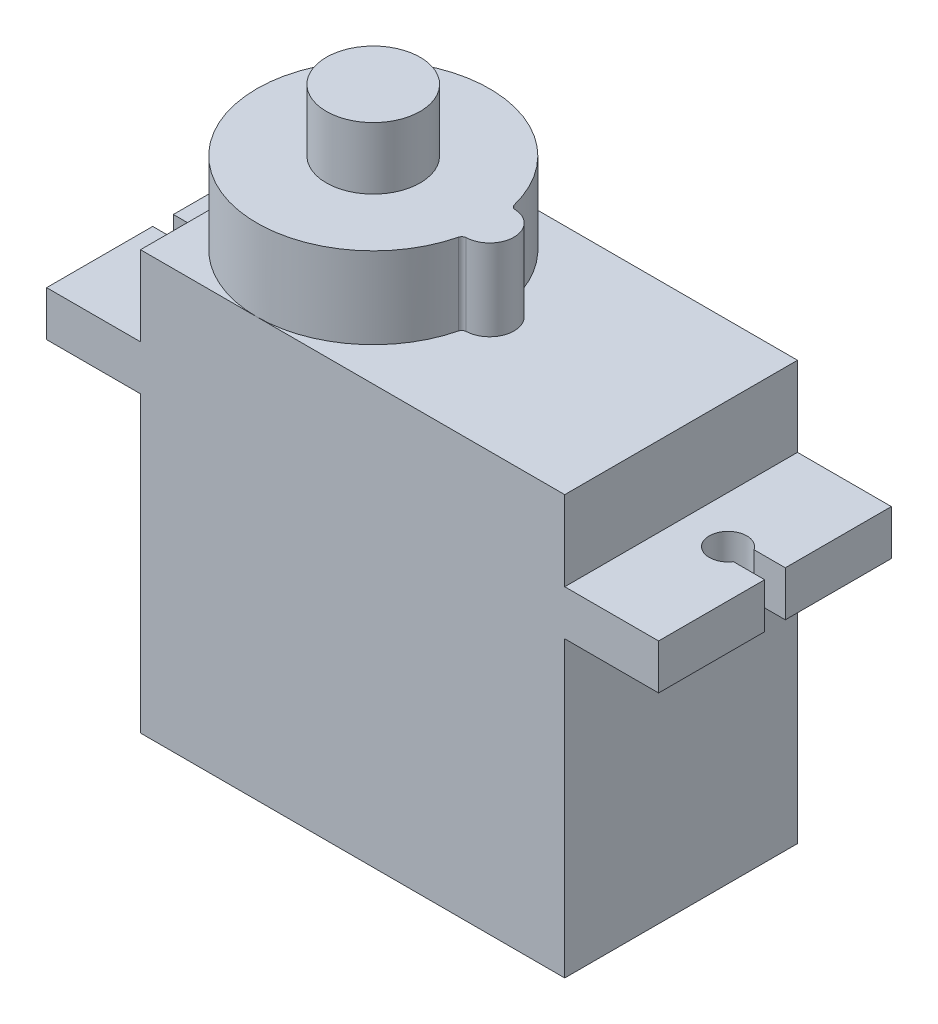
ISO-10303-21;
HEADER;
FILE_DESCRIPTION(('STEP AP214'),'2;1');
FILE_NAME('part.step','',(''),(''),'','','');
FILE_SCHEMA(('AUTOMOTIVE_DESIGN { 1 0 10303 214 1 1 1 1 }'));
ENDSEC;
DATA;
#1=APPLICATION_CONTEXT('core data for automotive mechanical design processes');
#2=APPLICATION_PROTOCOL_DEFINITION('international standard','automotive_design',2000,#1);
#3=PRODUCT_CONTEXT('',#1,'mechanical');
#4=PRODUCT('Part','Part','',(#3));
#5=PRODUCT_RELATED_PRODUCT_CATEGORY('part','',(#4));
#6=PRODUCT_DEFINITION_FORMATION('','',#4);
#7=PRODUCT_DEFINITION_CONTEXT('part definition',#1,'design');
#8=PRODUCT_DEFINITION('design','',#6,#7);
#9=PRODUCT_DEFINITION_SHAPE('','',#8);
#10=(LENGTH_UNIT() NAMED_UNIT(*) SI_UNIT(.MILLI.,.METRE.));
#11=(NAMED_UNIT(*) PLANE_ANGLE_UNIT() SI_UNIT($,.RADIAN.));
#12=(NAMED_UNIT(*) SI_UNIT($,.STERADIAN.) SOLID_ANGLE_UNIT());
#13=UNCERTAINTY_MEASURE_WITH_UNIT(LENGTH_MEASURE(1.E-05),#10,'distance_accuracy_value','');
#14=(GEOMETRIC_REPRESENTATION_CONTEXT(3) GLOBAL_UNCERTAINTY_ASSIGNED_CONTEXT((#13)) GLOBAL_UNIT_ASSIGNED_CONTEXT((#10,
#11,#12)) REPRESENTATION_CONTEXT('',''));
#15=CARTESIAN_POINT('',(0.,0.,0.));
#16=DIRECTION('',(0.,0.,1.));
#17=DIRECTION('',(1.,0.,0.));
#18=AXIS2_PLACEMENT_3D('',#15,#16,#17);
#19=CARTESIAN_POINT('',(-13.6,4.5,-1.2));
#20=DIRECTION('',(1.,0.,0.));
#21=DIRECTION('',(0.,0.,-1.));
#22=AXIS2_PLACEMENT_3D('',#19,#20,#21);
#23=CYLINDRICAL_SURFACE('',#22,0.6);
#24=CARTESIAN_POINT('',(-13.6,4.5,-1.2));
#25=DIRECTION('',(-1.,0.,0.));
#26=DIRECTION('',(0.,0.,1.));
#27=AXIS2_PLACEMENT_3D('',#24,#25,#26);
#28=CIRCLE('',#27,0.6);
#29=CARTESIAN_POINT('',(-13.6,4.5,-0.6));
#30=VERTEX_POINT('',#29);
#31=EDGE_CURVE('E12',#30,#30,#28,.T.);
#32=ORIENTED_EDGE('',*,*,#31,.F.);
#33=EDGE_LOOP('',(#32));
#34=FACE_BOUND('',#33,.T.);
#35=CARTESIAN_POINT('',(-11.3,4.5,-1.2));
#36=DIRECTION('',(-1.,0.,0.));
#37=DIRECTION('',(0.,0.,1.));
#38=AXIS2_PLACEMENT_3D('',#35,#36,#37);
#39=CIRCLE('',#38,0.6);
#40=CARTESIAN_POINT('',(-11.3,4.5,-0.6));
#41=VERTEX_POINT('',#40);
#42=EDGE_CURVE('E65',#41,#41,#39,.T.);
#43=ORIENTED_EDGE('',*,*,#42,.T.);
#44=EDGE_LOOP('',(#43));
#45=FACE_BOUND('',#44,.T.);
#46=ADVANCED_FACE('F62',(#34,#45),#23,.T.);
#47=CARTESIAN_POINT('',(-13.6,0.,0.));
#48=DIRECTION('',(-1.,0.,0.));
#49=DIRECTION('',(0.,0.,1.));
#50=AXIS2_PLACEMENT_3D('',#47,#48,#49);
#51=PLANE('',#50);
#52=ORIENTED_EDGE('',*,*,#31,.T.);
#53=EDGE_LOOP('',(#52));
#54=FACE_BOUND('',#53,.T.);
#55=ADVANCED_FACE('F77',(#54),#51,.T.);
#56=CARTESIAN_POINT('',(-11.3,0.,0.));
#57=DIRECTION('',(-1.,0.,0.));
#58=DIRECTION('',(0.,0.,1.));
#59=AXIS2_PLACEMENT_3D('',#56,#57,#58);
#60=PLANE('',#59);
#61=ORIENTED_EDGE('',*,*,#42,.F.);
#62=EDGE_LOOP('',(#61));
#63=FACE_BOUND('',#62,.T.);
#64=ADVANCED_FACE('F75',(#63),#60,.F.);
#65=CLOSED_SHELL('',(#46,#55,#64));
#66=MANIFOLD_SOLID_BREP('B2',#65);
#67=CARTESIAN_POINT('',(-13.6,4.5,0.));
#68=DIRECTION('',(1.,0.,0.));
#69=DIRECTION('',(0.,0.,-1.));
#70=AXIS2_PLACEMENT_3D('',#67,#68,#69);
#71=CYLINDRICAL_SURFACE('',#70,0.6);
#72=CARTESIAN_POINT('',(-13.6,4.5,0.));
#73=DIRECTION('',(-1.,0.,0.));
#74=DIRECTION('',(0.,0.,1.));
#75=AXIS2_PLACEMENT_3D('',#72,#73,#74);
#76=CIRCLE('',#75,0.6);
#77=CARTESIAN_POINT('',(-13.6,4.5,0.6));
#78=VERTEX_POINT('',#77);
#79=EDGE_CURVE('E61',#78,#78,#76,.T.);
#80=ORIENTED_EDGE('',*,*,#79,.F.);
#81=EDGE_LOOP('',(#80));
#82=FACE_BOUND('',#81,.T.);
#83=CARTESIAN_POINT('',(-11.3,4.5,0.));
#84=DIRECTION('',(-1.,0.,0.));
#85=DIRECTION('',(0.,0.,1.));
#86=AXIS2_PLACEMENT_3D('',#83,#84,#85);
#87=CIRCLE('',#86,0.6);
#88=CARTESIAN_POINT('',(-11.3,4.5,0.6));
#89=VERTEX_POINT('',#88);
#90=EDGE_CURVE('E114',#89,#89,#87,.T.);
#91=ORIENTED_EDGE('',*,*,#90,.T.);
#92=EDGE_LOOP('',(#91));
#93=FACE_BOUND('',#92,.T.);
#94=ADVANCED_FACE('F111',(#82,#93),#71,.T.);
#95=CARTESIAN_POINT('',(-13.6,0.,0.));
#96=DIRECTION('',(-1.,0.,0.));
#97=DIRECTION('',(0.,0.,1.));
#98=AXIS2_PLACEMENT_3D('',#95,#96,#97);
#99=PLANE('',#98);
#100=ORIENTED_EDGE('',*,*,#79,.T.);
#101=EDGE_LOOP('',(#100));
#102=FACE_BOUND('',#101,.T.);
#103=ADVANCED_FACE('F126',(#102),#99,.T.);
#104=CARTESIAN_POINT('',(-11.3,0.,0.));
#105=DIRECTION('',(-1.,0.,0.));
#106=DIRECTION('',(0.,0.,1.));
#107=AXIS2_PLACEMENT_3D('',#104,#105,#106);
#108=PLANE('',#107);
#109=ORIENTED_EDGE('',*,*,#90,.F.);
#110=EDGE_LOOP('',(#109));
#111=FACE_BOUND('',#110,.T.);
#112=ADVANCED_FACE('F124',(#111),#108,.F.);
#113=CLOSED_SHELL('',(#94,#103,#112));
#114=MANIFOLD_SOLID_BREP('B7',#113);
#115=CARTESIAN_POINT('',(-13.6,4.5,1.2));
#116=DIRECTION('',(1.,0.,0.));
#117=DIRECTION('',(0.,0.,-1.));
#118=AXIS2_PLACEMENT_3D('',#115,#116,#117);
#119=CYLINDRICAL_SURFACE('',#118,0.6);
#120=CARTESIAN_POINT('',(-13.6,4.5,1.2));
#121=DIRECTION('',(-1.,0.,0.));
#122=DIRECTION('',(0.,0.,1.));
#123=AXIS2_PLACEMENT_3D('',#120,#121,#122);
#124=CIRCLE('',#123,0.6);
#125=CARTESIAN_POINT('',(-13.6,4.5,1.8));
#126=VERTEX_POINT('',#125);
#127=EDGE_CURVE('E110',#126,#126,#124,.T.);
#128=ORIENTED_EDGE('',*,*,#127,.F.);
#129=EDGE_LOOP('',(#128));
#130=FACE_BOUND('',#129,.T.);
#131=CARTESIAN_POINT('',(-11.3,4.5,1.2));
#132=DIRECTION('',(-1.,0.,0.));
#133=DIRECTION('',(0.,0.,1.));
#134=AXIS2_PLACEMENT_3D('',#131,#132,#133);
#135=CIRCLE('',#134,0.6);
#136=CARTESIAN_POINT('',(-11.3,4.5,1.8));
#137=VERTEX_POINT('',#136);
#138=EDGE_CURVE('E164',#137,#137,#135,.T.);
#139=ORIENTED_EDGE('',*,*,#138,.T.);
#140=EDGE_LOOP('',(#139));
#141=FACE_BOUND('',#140,.T.);
#142=ADVANCED_FACE('F161',(#130,#141),#119,.T.);
#143=CARTESIAN_POINT('',(-13.6,0.,0.));
#144=DIRECTION('',(-1.,0.,0.));
#145=DIRECTION('',(0.,0.,1.));
#146=AXIS2_PLACEMENT_3D('',#143,#144,#145);
#147=PLANE('',#146);
#148=ORIENTED_EDGE('',*,*,#127,.T.);
#149=EDGE_LOOP('',(#148));
#150=FACE_BOUND('',#149,.T.);
#151=ADVANCED_FACE('F176',(#150),#147,.T.);
#152=CARTESIAN_POINT('',(-11.3,0.,0.));
#153=DIRECTION('',(-1.,0.,0.));
#154=DIRECTION('',(0.,0.,1.));
#155=AXIS2_PLACEMENT_3D('',#152,#153,#154);
#156=PLANE('',#155);
#157=ORIENTED_EDGE('',*,*,#138,.F.);
#158=EDGE_LOOP('',(#157));
#159=FACE_BOUND('',#158,.T.);
#160=ADVANCED_FACE('F174',(#159),#156,.F.);
#161=CLOSED_SHELL('',(#142,#151,#160));
#162=MANIFOLD_SOLID_BREP('B56',#161);
#163=CARTESIAN_POINT('',(0.,22.3,0.));
#164=DIRECTION('',(0.,1.,0.));
#165=DIRECTION('',(0.,0.,1.));
#166=AXIS2_PLACEMENT_3D('',#163,#164,#165);
#167=PLANE('',#166);
#168=CARTESIAN_POINT('',(-5.1,22.3,0.));
#169=DIRECTION('',(0.,1.,0.));
#170=DIRECTION('',(0.,0.,1.));
#171=AXIS2_PLACEMENT_3D('',#168,#169,#170);
#172=CIRCLE('',#171,6.2);
#173=CARTESIAN_POINT('',(-5.1,22.3,-6.2));
#174=VERTEX_POINT('',#173);
#175=CARTESIAN_POINT('',(-11.3,22.3,0.));
#176=VERTEX_POINT('',#175);
#177=EDGE_CURVE('E159',#174,#176,#172,.T.);
#178=ORIENTED_EDGE('',*,*,#177,.F.);
#179=DIRECTION('',(-1.,0.,0.));
#180=VECTOR('',#179,1.);
#181=CARTESIAN_POINT('',(-11.3,22.3,-6.2));
#182=LINE('',#181,#180);
#183=CARTESIAN_POINT('',(-11.3,22.3,-6.2));
#184=VERTEX_POINT('',#183);
#185=EDGE_CURVE('E539',#174,#184,#182,.T.);
#186=ORIENTED_EDGE('',*,*,#185,.T.);
#187=DIRECTION('',(0.,0.,1.));
#188=VECTOR('',#187,1.);
#189=CARTESIAN_POINT('',(-11.3,22.3,-6.2));
#190=LINE('',#189,#188);
#191=EDGE_CURVE('E545',#184,#176,#190,.T.);
#192=ORIENTED_EDGE('',*,*,#191,.T.);
#193=EDGE_LOOP('',(#178,#186,#192));
#194=FACE_BOUND('',#193,.T.);
#195=ADVANCED_FACE('F202',(#194),#167,.T.);
#196=CARTESIAN_POINT('',(-5.1,22.3,6.2));
#197=VERTEX_POINT('',#196);
#198=EDGE_CURVE('E212',#176,#197,#172,.T.);
#199=ORIENTED_EDGE('',*,*,#198,.F.);
#200=CARTESIAN_POINT('',(-11.3,22.3,6.2));
#201=VERTEX_POINT('',#200);
#202=EDGE_CURVE('E544',#176,#201,#190,.T.);
#203=ORIENTED_EDGE('',*,*,#202,.T.);
#204=DIRECTION('',(1.,0.,0.));
#205=VECTOR('',#204,1.);
#206=CARTESIAN_POINT('',(-11.3,22.3,6.2));
#207=LINE('',#206,#205);
#208=EDGE_CURVE('E550',#201,#197,#207,.T.);
#209=ORIENTED_EDGE('',*,*,#208,.T.);
#210=EDGE_LOOP('',(#199,#203,#209));
#211=FACE_BOUND('',#210,.T.);
#212=ADVANCED_FACE('F660',(#211),#167,.T.);
#213=CARTESIAN_POINT('',(-16.3,18.05,-6.2));
#214=DIRECTION('',(-1.,0.,0.));
#215=DIRECTION('',(0.,0.,1.));
#216=AXIS2_PLACEMENT_3D('',#213,#214,#215);
#217=PLANE('',#216);
#218=DIRECTION('',(0.,-1.,0.));
#219=VECTOR('',#218,1.);
#220=CARTESIAN_POINT('',(-16.3,18.05,-0.55));
#221=LINE('',#220,#219);
#222=CARTESIAN_POINT('',(-16.3,18.05,-0.55));
#223=VERTEX_POINT('',#222);
#224=CARTESIAN_POINT('',(-16.3,15.65,-0.55));
#225=VERTEX_POINT('',#224);
#226=EDGE_CURVE('E601',#223,#225,#221,.T.);
#227=ORIENTED_EDGE('',*,*,#226,.F.);
#228=DIRECTION('',(0.,0.,1.));
#229=VECTOR('',#228,1.);
#230=CARTESIAN_POINT('',(-16.3,18.05,-6.2));
#231=LINE('',#230,#229);
#232=CARTESIAN_POINT('',(-16.3,18.05,-6.2));
#233=VERTEX_POINT('',#232);
#234=EDGE_CURVE('E491',#233,#223,#231,.T.);
#235=ORIENTED_EDGE('',*,*,#234,.F.);
#236=DIRECTION('',(0.,-1.,0.));
#237=VECTOR('',#236,1.);
#238=CARTESIAN_POINT('',(-16.3,18.05,-6.2));
#239=LINE('',#238,#237);
#240=CARTESIAN_POINT('',(-16.3,15.65,-6.2));
#241=VERTEX_POINT('',#240);
#242=EDGE_CURVE('E459',#233,#241,#239,.T.);
#243=ORIENTED_EDGE('',*,*,#242,.T.);
#244=DIRECTION('',(0.,0.,1.));
#245=VECTOR('',#244,1.);
#246=CARTESIAN_POINT('',(-16.3,15.65,-6.2));
#247=LINE('',#246,#245);
#248=EDGE_CURVE('E486',#241,#225,#247,.T.);
#249=ORIENTED_EDGE('',*,*,#248,.T.);
#250=EDGE_LOOP('',(#227,#235,#243,#249));
#251=FACE_BOUND('',#250,.T.);
#252=ADVANCED_FACE('F667',(#251),#217,.T.);
#253=CARTESIAN_POINT('',(11.3,18.05,-6.2));
#254=DIRECTION('',(0.,1.,0.));
#255=DIRECTION('',(0.,0.,1.));
#256=AXIS2_PLACEMENT_3D('',#253,#254,#255);
#257=PLANE('',#256);
#258=CARTESIAN_POINT('',(13.8,18.05,0.));
#259=DIRECTION('',(0.,1.,0.));
#260=DIRECTION('',(0.,0.,1.));
#261=AXIS2_PLACEMENT_3D('',#258,#259,#260);
#262=CIRCLE('',#261,1.);
#263=CARTESIAN_POINT('',(14.6351646544245,18.05,-0.55));
#264=VERTEX_POINT('',#263);
#265=CARTESIAN_POINT('',(14.6351646544245,18.05,0.55));
#266=VERTEX_POINT('',#265);
#267=EDGE_CURVE('E433',#264,#266,#262,.T.);
#268=ORIENTED_EDGE('',*,*,#267,.F.);
#269=DIRECTION('',(1.,0.,0.));
#270=VECTOR('',#269,1.);
#271=CARTESIAN_POINT('',(0.,18.05,-0.549999999999999));
#272=LINE('',#271,#270);
#273=CARTESIAN_POINT('',(16.3,18.05,-0.55));
#274=VERTEX_POINT('',#273);
#275=EDGE_CURVE('E429',#264,#274,#272,.T.);
#276=ORIENTED_EDGE('',*,*,#275,.T.);
#277=DIRECTION('',(0.,0.,1.));
#278=VECTOR('',#277,1.);
#279=CARTESIAN_POINT('',(16.3,18.05,-6.2));
#280=LINE('',#279,#278);
#281=CARTESIAN_POINT('',(16.3,18.05,-6.2));
#282=VERTEX_POINT('',#281);
#283=EDGE_CURVE('E522',#282,#274,#280,.T.);
#284=ORIENTED_EDGE('',*,*,#283,.F.);
#285=DIRECTION('',(-1.,0.,0.));
#286=VECTOR('',#285,1.);
#287=CARTESIAN_POINT('',(11.3,18.05,-6.2));
#288=LINE('',#287,#286);
#289=CARTESIAN_POINT('',(11.3,18.05,-6.2));
#290=VERTEX_POINT('',#289);
#291=EDGE_CURVE('E504',#282,#290,#288,.T.);
#292=ORIENTED_EDGE('',*,*,#291,.T.);
#293=DIRECTION('',(0.,0.,1.));
#294=VECTOR('',#293,1.);
#295=CARTESIAN_POINT('',(11.3,18.05,-6.2));
#296=LINE('',#295,#294);
#297=CARTESIAN_POINT('',(11.3,18.05,6.2));
#298=VERTEX_POINT('',#297);
#299=EDGE_CURVE('E518',#290,#298,#296,.T.);
#300=ORIENTED_EDGE('',*,*,#299,.T.);
#301=DIRECTION('',(-1.,0.,0.));
#302=VECTOR('',#301,1.);
#303=CARTESIAN_POINT('',(11.3,18.05,6.2));
#304=LINE('',#303,#302);
#305=CARTESIAN_POINT('',(16.3,18.05,6.2));
#306=VERTEX_POINT('',#305);
#307=EDGE_CURVE('E500',#306,#298,#304,.T.);
#308=ORIENTED_EDGE('',*,*,#307,.F.);
#309=CARTESIAN_POINT('',(16.3,18.05,0.55));
#310=VERTEX_POINT('',#309);
#311=EDGE_CURVE('E526',#310,#306,#280,.T.);
#312=ORIENTED_EDGE('',*,*,#311,.F.);
#313=DIRECTION('',(-1.,0.,0.));
#314=VECTOR('',#313,1.);
#315=CARTESIAN_POINT('',(0.,18.05,0.549999999999999));
#316=LINE('',#315,#314);
#317=EDGE_CURVE('E437',#310,#266,#316,.T.);
#318=ORIENTED_EDGE('',*,*,#317,.T.);
#319=EDGE_LOOP('',(#268,#276,#284,#292,#300,#308,#312,#318));
#320=FACE_BOUND('',#319,.T.);
#321=ADVANCED_FACE('F706',(#320),#257,.T.);
#322=CARTESIAN_POINT('',(16.3,18.05,-6.2));
#323=DIRECTION('',(1.,0.,0.));
#324=DIRECTION('',(0.,0.,-1.));
#325=AXIS2_PLACEMENT_3D('',#322,#323,#324);
#326=PLANE('',#325);
#327=ORIENTED_EDGE('',*,*,#283,.T.);
#328=DIRECTION('',(0.,1.,0.));
#329=VECTOR('',#328,1.);
#330=CARTESIAN_POINT('',(16.3,0.,-0.55));
#331=LINE('',#330,#329);
#332=CARTESIAN_POINT('',(16.3,15.65,-0.55));
#333=VERTEX_POINT('',#332);
#334=EDGE_CURVE('E442',#333,#274,#331,.T.);
#335=ORIENTED_EDGE('',*,*,#334,.F.);
#336=DIRECTION('',(0.,0.,1.));
#337=VECTOR('',#336,1.);
#338=CARTESIAN_POINT('',(16.3,15.65,-6.2));
#339=LINE('',#338,#337);
#340=CARTESIAN_POINT('',(16.3,15.65,-6.2));
#341=VERTEX_POINT('',#340);
#342=EDGE_CURVE('E527',#341,#333,#339,.T.);
#343=ORIENTED_EDGE('',*,*,#342,.F.);
#344=DIRECTION('',(0.,1.,0.));
#345=VECTOR('',#344,1.);
#346=CARTESIAN_POINT('',(16.3,18.05,-6.2));
#347=LINE('',#346,#345);
#348=EDGE_CURVE('E499',#341,#282,#347,.T.);
#349=ORIENTED_EDGE('',*,*,#348,.T.);
#350=EDGE_LOOP('',(#327,#335,#343,#349));
#351=FACE_BOUND('',#350,.T.);
#352=ADVANCED_FACE('F711',(#351),#326,.T.);
#353=CARTESIAN_POINT('',(16.3,15.65,0.55));
#354=VERTEX_POINT('',#353);
#355=CARTESIAN_POINT('',(16.3,15.65,6.2));
#356=VERTEX_POINT('',#355);
#357=EDGE_CURVE('E531',#354,#356,#339,.T.);
#358=ORIENTED_EDGE('',*,*,#357,.F.);
#359=DIRECTION('',(0.,1.,0.));
#360=VECTOR('',#359,1.);
#361=CARTESIAN_POINT('',(16.3,0.,0.55));
#362=LINE('',#361,#360);
#363=EDGE_CURVE('E446',#354,#310,#362,.T.);
#364=ORIENTED_EDGE('',*,*,#363,.T.);
#365=ORIENTED_EDGE('',*,*,#311,.T.);
#366=DIRECTION('',(0.,1.,0.));
#367=VECTOR('',#366,1.);
#368=CARTESIAN_POINT('',(16.3,18.05,6.2));
#369=LINE('',#368,#367);
#370=EDGE_CURVE('E511',#356,#306,#369,.T.);
#371=ORIENTED_EDGE('',*,*,#370,.F.);
#372=EDGE_LOOP('',(#358,#364,#365,#371));
#373=FACE_BOUND('',#372,.T.);
#374=ADVANCED_FACE('F763',(#373),#326,.T.);
#375=CARTESIAN_POINT('',(11.3,15.65,-6.2));
#376=DIRECTION('',(0.,-1.,0.));
#377=DIRECTION('',(0.,0.,-1.));
#378=AXIS2_PLACEMENT_3D('',#375,#376,#377);
#379=PLANE('',#378);
#380=ORIENTED_EDGE('',*,*,#342,.T.);
#381=DIRECTION('',(-1.,0.,0.));
#382=VECTOR('',#381,1.);
#383=CARTESIAN_POINT('',(11.3,15.65,-0.55));
#384=LINE('',#383,#382);
#385=CARTESIAN_POINT('',(14.6351646544245,15.65,-0.55));
#386=VERTEX_POINT('',#385);
#387=EDGE_CURVE('E595',#333,#386,#384,.T.);
#388=ORIENTED_EDGE('',*,*,#387,.T.);
#389=CARTESIAN_POINT('',(13.8,15.65,0.));
#390=DIRECTION('',(0.,-1.,0.));
#391=DIRECTION('',(0.,0.,-1.));
#392=AXIS2_PLACEMENT_3D('',#389,#390,#391);
#393=CIRCLE('',#392,1.);
#394=CARTESIAN_POINT('',(14.6351646544245,15.65,0.549999999999999));
#395=VERTEX_POINT('',#394);
#396=EDGE_CURVE('E588',#395,#386,#393,.T.);
#397=ORIENTED_EDGE('',*,*,#396,.F.);
#398=DIRECTION('',(1.,0.,0.));
#399=VECTOR('',#398,1.);
#400=CARTESIAN_POINT('',(11.3,15.65,0.55));
#401=LINE('',#400,#399);
#402=EDGE_CURVE('E591',#395,#354,#401,.T.);
#403=ORIENTED_EDGE('',*,*,#402,.T.);
#404=ORIENTED_EDGE('',*,*,#357,.T.);
#405=DIRECTION('',(1.,0.,0.));
#406=VECTOR('',#405,1.);
#407=CARTESIAN_POINT('',(11.3,15.65,6.2));
#408=LINE('',#407,#406);
#409=CARTESIAN_POINT('',(11.3,15.65,6.2));
#410=VERTEX_POINT('',#409);
#411=EDGE_CURVE('E482',#410,#356,#408,.T.);
#412=ORIENTED_EDGE('',*,*,#411,.F.);
#413=DIRECTION('',(0.,0.,1.));
#414=VECTOR('',#413,1.);
#415=CARTESIAN_POINT('',(11.3,15.65,-6.2));
#416=LINE('',#415,#414);
#417=CARTESIAN_POINT('',(11.3,15.65,-6.2));
#418=VERTEX_POINT('',#417);
#419=EDGE_CURVE('E507',#418,#410,#416,.T.);
#420=ORIENTED_EDGE('',*,*,#419,.F.);
#421=DIRECTION('',(1.,0.,0.));
#422=VECTOR('',#421,1.);
#423=CARTESIAN_POINT('',(11.3,15.65,-6.2));
#424=LINE('',#423,#422);
#425=EDGE_CURVE('E495',#418,#341,#424,.T.);
#426=ORIENTED_EDGE('',*,*,#425,.T.);
#427=EDGE_LOOP('',(#380,#388,#397,#403,#404,#412,#420,#426));
#428=FACE_BOUND('',#427,.T.);
#429=ADVANCED_FACE('F713',(#428),#379,.T.);
#430=CARTESIAN_POINT('',(-11.3,22.3,-6.2));
#431=DIRECTION('',(1.,0.,0.));
#432=DIRECTION('',(0.,0.,-1.));
#433=AXIS2_PLACEMENT_3D('',#430,#431,#432);
#434=PLANE('',#433);
#435=DIRECTION('',(0.,0.,1.));
#436=VECTOR('',#435,1.);
#437=CARTESIAN_POINT('',(-11.3,15.65,-6.2));
#438=LINE('',#437,#436);
#439=CARTESIAN_POINT('',(-11.3,15.65,-6.2));
#440=VERTEX_POINT('',#439);
#441=CARTESIAN_POINT('',(-11.3,15.65,6.2));
#442=VERTEX_POINT('',#441);
#443=EDGE_CURVE('E483',#440,#442,#438,.T.);
#444=ORIENTED_EDGE('',*,*,#443,.F.);
#445=DIRECTION('',(0.,-1.,0.));
#446=VECTOR('',#445,1.);
#447=CARTESIAN_POINT('',(-11.3,22.3,-6.2));
#448=LINE('',#447,#446);
#449=CARTESIAN_POINT('',(-11.3,0.,-6.2));
#450=VERTEX_POINT('',#449);
#451=EDGE_CURVE('E578',#440,#450,#448,.T.);
#452=ORIENTED_EDGE('',*,*,#451,.T.);
#453=DIRECTION('',(0.,0.,1.));
#454=VECTOR('',#453,1.);
#455=CARTESIAN_POINT('',(-11.3,0.,-6.2));
#456=LINE('',#455,#454);
#457=CARTESIAN_POINT('',(-11.3,0.,6.2));
#458=VERTEX_POINT('',#457);
#459=EDGE_CURVE('E562',#450,#458,#456,.T.);
#460=ORIENTED_EDGE('',*,*,#459,.T.);
#461=DIRECTION('',(0.,-1.,0.));
#462=VECTOR('',#461,1.);
#463=CARTESIAN_POINT('',(-11.3,22.3,6.2));
#464=LINE('',#463,#462);
#465=EDGE_CURVE('E573',#442,#458,#464,.T.);
#466=ORIENTED_EDGE('',*,*,#465,.F.);
#467=EDGE_LOOP('',(#444,#452,#460,#466));
#468=FACE_BOUND('',#467,.T.);
#469=ADVANCED_FACE('F756',(#468),#434,.F.);
#470=CARTESIAN_POINT('',(11.3,22.3,-6.2));
#471=DIRECTION('',(-1.,0.,0.));
#472=DIRECTION('',(0.,0.,1.));
#473=AXIS2_PLACEMENT_3D('',#470,#471,#472);
#474=PLANE('',#473);
#475=ORIENTED_EDGE('',*,*,#299,.F.);
#476=DIRECTION('',(0.,-1.,0.));
#477=VECTOR('',#476,1.);
#478=CARTESIAN_POINT('',(11.3,22.3,-6.2));
#479=LINE('',#478,#477);
#480=CARTESIAN_POINT('',(11.3,22.3,-6.2));
#481=VERTEX_POINT('',#480);
#482=EDGE_CURVE('E584',#481,#290,#479,.T.);
#483=ORIENTED_EDGE('',*,*,#482,.F.);
#484=DIRECTION('',(0.,0.,-1.));
#485=VECTOR('',#484,1.);
#486=CARTESIAN_POINT('',(11.3,22.3,-6.2));
#487=LINE('',#486,#485);
#488=CARTESIAN_POINT('',(11.3,22.3,6.2));
#489=VERTEX_POINT('',#488);
#490=EDGE_CURVE('E535',#489,#481,#487,.T.);
#491=ORIENTED_EDGE('',*,*,#490,.F.);
#492=DIRECTION('',(0.,-1.,0.));
#493=VECTOR('',#492,1.);
#494=CARTESIAN_POINT('',(11.3,22.3,6.2));
#495=LINE('',#494,#493);
#496=EDGE_CURVE('E569',#489,#298,#495,.T.);
#497=ORIENTED_EDGE('',*,*,#496,.T.);
#498=EDGE_LOOP('',(#475,#483,#491,#497));
#499=FACE_BOUND('',#498,.T.);
#500=ADVANCED_FACE('F700',(#499),#474,.F.);
#501=CARTESIAN_POINT('',(11.3,0.,-6.2));
#502=VERTEX_POINT('',#501);
#503=EDGE_CURVE('E583',#418,#502,#479,.T.);
#504=ORIENTED_EDGE('',*,*,#503,.F.);
#505=ORIENTED_EDGE('',*,*,#419,.T.);
#506=CARTESIAN_POINT('',(11.3,0.,6.2));
#507=VERTEX_POINT('',#506);
#508=EDGE_CURVE('E554',#410,#507,#495,.T.);
#509=ORIENTED_EDGE('',*,*,#508,.T.);
#510=DIRECTION('',(0.,0.,-1.));
#511=VECTOR('',#510,1.);
#512=CARTESIAN_POINT('',(11.3,0.,-6.2));
#513=LINE('',#512,#511);
#514=EDGE_CURVE('E521',#507,#502,#513,.T.);
#515=ORIENTED_EDGE('',*,*,#514,.T.);
#516=EDGE_LOOP('',(#504,#505,#509,#515));
#517=FACE_BOUND('',#516,.T.);
#518=ADVANCED_FACE('F204',(#517),#474,.F.);
#519=CARTESIAN_POINT('',(-11.3,22.3,-6.2));
#520=DIRECTION('',(0.,0.,1.));
#521=DIRECTION('',(1.,0.,0.));
#522=AXIS2_PLACEMENT_3D('',#519,#520,#521);
#523=PLANE('',#522);
#524=DIRECTION('',(-1.,0.,0.));
#525=VECTOR('',#524,1.);
#526=CARTESIAN_POINT('',(-11.3,0.,-6.2));
#527=LINE('',#526,#525);
#528=EDGE_CURVE('E558',#502,#450,#527,.T.);
#529=ORIENTED_EDGE('',*,*,#528,.T.);
#530=ORIENTED_EDGE('',*,*,#451,.F.);
#531=DIRECTION('',(1.,0.,0.));
#532=VECTOR('',#531,1.);
#533=CARTESIAN_POINT('',(-11.3,15.65,-6.2));
#534=LINE('',#533,#532);
#535=EDGE_CURVE('E464',#241,#440,#534,.T.);
#536=ORIENTED_EDGE('',*,*,#535,.F.);
#537=ORIENTED_EDGE('',*,*,#242,.F.);
#538=DIRECTION('',(-1.,0.,0.));
#539=VECTOR('',#538,1.);
#540=CARTESIAN_POINT('',(-11.3,18.05,-6.2));
#541=LINE('',#540,#539);
#542=CARTESIAN_POINT('',(-11.3,18.05,-6.2));
#543=VERTEX_POINT('',#542);
#544=EDGE_CURVE('E455',#543,#233,#541,.T.);
#545=ORIENTED_EDGE('',*,*,#544,.F.);
#546=EDGE_CURVE('E579',#184,#543,#448,.T.);
#547=ORIENTED_EDGE('',*,*,#546,.F.);
#548=ORIENTED_EDGE('',*,*,#185,.F.);
#549=EDGE_CURVE('E541',#481,#174,#182,.T.);
#550=ORIENTED_EDGE('',*,*,#549,.F.);
#551=ORIENTED_EDGE('',*,*,#482,.T.);
#552=ORIENTED_EDGE('',*,*,#291,.F.);
#553=ORIENTED_EDGE('',*,*,#348,.F.);
#554=ORIENTED_EDGE('',*,*,#425,.F.);
#555=ORIENTED_EDGE('',*,*,#503,.T.);
#556=EDGE_LOOP('',(#529,#530,#536,#537,#545,#547,#548,#550,#551,#552,#553,#554,#555));
#557=FACE_BOUND('',#556,.T.);
#558=ADVANCED_FACE('F694',(#557),#523,.F.);
#559=ORIENTED_EDGE('',*,*,#546,.T.);
#560=DIRECTION('',(0.,0.,1.));
#561=VECTOR('',#560,1.);
#562=CARTESIAN_POINT('',(-11.3,18.05,-6.2));
#563=LINE('',#562,#561);
#564=CARTESIAN_POINT('',(-11.3,18.05,6.2));
#565=VERTEX_POINT('',#564);
#566=EDGE_CURVE('E478',#543,#565,#563,.T.);
#567=ORIENTED_EDGE('',*,*,#566,.T.);
#568=EDGE_CURVE('E574',#201,#565,#464,.T.);
#569=ORIENTED_EDGE('',*,*,#568,.F.);
#570=ORIENTED_EDGE('',*,*,#202,.F.);
#571=ORIENTED_EDGE('',*,*,#191,.F.);
#572=EDGE_LOOP('',(#559,#567,#569,#570,#571));
#573=FACE_BOUND('',#572,.T.);
#574=ADVANCED_FACE('F680',(#573),#434,.F.);
#575=CARTESIAN_POINT('',(-11.3,22.3,6.2));
#576=DIRECTION('',(0.,0.,-1.));
#577=DIRECTION('',(-1.,0.,0.));
#578=AXIS2_PLACEMENT_3D('',#575,#576,#577);
#579=PLANE('',#578);
#580=DIRECTION('',(1.,0.,0.));
#581=VECTOR('',#580,1.);
#582=CARTESIAN_POINT('',(-11.3,0.,6.2));
#583=LINE('',#582,#581);
#584=EDGE_CURVE('E540',#458,#507,#583,.T.);
#585=ORIENTED_EDGE('',*,*,#584,.T.);
#586=ORIENTED_EDGE('',*,*,#508,.F.);
#587=ORIENTED_EDGE('',*,*,#411,.T.);
#588=ORIENTED_EDGE('',*,*,#370,.T.);
#589=ORIENTED_EDGE('',*,*,#307,.T.);
#590=ORIENTED_EDGE('',*,*,#496,.F.);
#591=EDGE_CURVE('E549',#197,#489,#207,.T.);
#592=ORIENTED_EDGE('',*,*,#591,.F.);
#593=ORIENTED_EDGE('',*,*,#208,.F.);
#594=ORIENTED_EDGE('',*,*,#568,.T.);
#595=DIRECTION('',(-1.,0.,0.));
#596=VECTOR('',#595,1.);
#597=CARTESIAN_POINT('',(-11.3,18.05,6.2));
#598=LINE('',#597,#596);
#599=CARTESIAN_POINT('',(-16.3,18.05,6.2));
#600=VERTEX_POINT('',#599);
#601=EDGE_CURVE('E445',#565,#600,#598,.T.);
#602=ORIENTED_EDGE('',*,*,#601,.T.);
#603=DIRECTION('',(0.,-1.,0.));
#604=VECTOR('',#603,1.);
#605=CARTESIAN_POINT('',(-16.3,18.05,6.2));
#606=LINE('',#605,#604);
#607=CARTESIAN_POINT('',(-16.3,15.65,6.2));
#608=VERTEX_POINT('',#607);
#609=EDGE_CURVE('E471',#600,#608,#606,.T.);
#610=ORIENTED_EDGE('',*,*,#609,.T.);
#611=DIRECTION('',(1.,0.,0.));
#612=VECTOR('',#611,1.);
#613=CARTESIAN_POINT('',(-11.3,15.65,6.2));
#614=LINE('',#613,#612);
#615=EDGE_CURVE('E460',#608,#442,#614,.T.);
#616=ORIENTED_EDGE('',*,*,#615,.T.);
#617=ORIENTED_EDGE('',*,*,#465,.T.);
#618=EDGE_LOOP('',(#585,#586,#587,#588,#589,#590,#592,#593,#594,#602,#610,#616,#617));
#619=FACE_BOUND('',#618,.T.);
#620=ADVANCED_FACE('F673',(#619),#579,.F.);
#621=CARTESIAN_POINT('',(0.91860465116279,22.3,1.48875721761529));
#622=VERTEX_POINT('',#621);
#623=EDGE_CURVE('E608',#197,#622,#172,.T.);
#624=ORIENTED_EDGE('',*,*,#623,.F.);
#625=ORIENTED_EDGE('',*,*,#591,.T.);
#626=ORIENTED_EDGE('',*,*,#490,.T.);
#627=ORIENTED_EDGE('',*,*,#549,.T.);
#628=CARTESIAN_POINT('',(0.91860465116279,22.3,-1.48875721761529));
#629=VERTEX_POINT('',#628);
#630=EDGE_CURVE('E214',#629,#174,#172,.T.);
#631=ORIENTED_EDGE('',*,*,#630,.F.);
#632=CARTESIAN_POINT('',(1.16129032258064,22.3,-1.54878775058365));
#633=DIRECTION('',(0.,-1.,0.));
#634=DIRECTION('',(0.,0.,-1.));
#635=AXIS2_PLACEMENT_3D('',#632,#633,#634);
#636=CIRCLE('',#635,0.25);
#637=CARTESIAN_POINT('',(1.15140478668054,22.3,-1.29898327468306));
#638=VERTEX_POINT('',#637);
#639=EDGE_CURVE('E618',#638,#629,#636,.T.);
#640=ORIENTED_EDGE('',*,*,#639,.F.);
#641=CARTESIAN_POINT('',(1.1,22.3,0.));
#642=DIRECTION('',(0.,1.,0.));
#643=DIRECTION('',(0.,0.,1.));
#644=AXIS2_PLACEMENT_3D('',#641,#642,#643);
#645=CIRCLE('',#644,1.3);
#646=CARTESIAN_POINT('',(1.15140478668054,22.3,1.29898327468306));
#647=VERTEX_POINT('',#646);
#648=EDGE_CURVE('E621',#647,#638,#645,.T.);
#649=ORIENTED_EDGE('',*,*,#648,.F.);
#650=CARTESIAN_POINT('',(1.16129032258064,22.3,1.54878775058365));
#651=DIRECTION('',(0.,-1.,0.));
#652=DIRECTION('',(0.,0.,1.));
#653=AXIS2_PLACEMENT_3D('',#650,#651,#652);
#654=CIRCLE('',#653,0.25);
#655=EDGE_CURVE('E221',#622,#647,#654,.T.);
#656=ORIENTED_EDGE('',*,*,#655,.F.);
#657=EDGE_LOOP('',(#624,#625,#626,#627,#631,#640,#649,#656));
#658=FACE_BOUND('',#657,.T.);
#659=ADVANCED_FACE('F663',(#658),#167,.T.);
#660=CARTESIAN_POINT('',(0.,0.,0.));
#661=DIRECTION('',(0.,1.,0.));
#662=DIRECTION('',(0.,0.,1.));
#663=AXIS2_PLACEMENT_3D('',#660,#661,#662);
#664=PLANE('',#663);
#665=ORIENTED_EDGE('',*,*,#514,.F.);
#666=ORIENTED_EDGE('',*,*,#584,.F.);
#667=ORIENTED_EDGE('',*,*,#459,.F.);
#668=ORIENTED_EDGE('',*,*,#528,.F.);
#669=EDGE_LOOP('',(#665,#666,#667,#668));
#670=FACE_BOUND('',#669,.T.);
#671=ADVANCED_FACE('F672',(#670),#664,.F.);
#672=CARTESIAN_POINT('',(-11.3,18.05,-6.2));
#673=DIRECTION('',(0.,1.,0.));
#674=DIRECTION('',(0.,0.,1.));
#675=AXIS2_PLACEMENT_3D('',#672,#673,#674);
#676=PLANE('',#675);
#677=DIRECTION('',(-1.,0.,0.));
#678=VECTOR('',#677,1.);
#679=CARTESIAN_POINT('',(0.,18.05,-0.549999999999999));
#680=LINE('',#679,#678);
#681=CARTESIAN_POINT('',(-14.6351646544245,18.05,-0.55));
#682=VERTEX_POINT('',#681);
#683=EDGE_CURVE('E400',#682,#223,#680,.T.);
#684=ORIENTED_EDGE('',*,*,#683,.F.);
#685=CARTESIAN_POINT('',(-13.8,18.05,0.));
#686=DIRECTION('',(0.,-1.,0.));
#687=DIRECTION('',(0.,0.,1.));
#688=AXIS2_PLACEMENT_3D('',#685,#686,#687);
#689=CIRCLE('',#688,1.);
#690=CARTESIAN_POINT('',(-14.6351646544245,18.05,0.55));
#691=VERTEX_POINT('',#690);
#692=EDGE_CURVE('E413',#682,#691,#689,.T.);
#693=ORIENTED_EDGE('',*,*,#692,.T.);
#694=DIRECTION('',(1.,0.,0.));
#695=VECTOR('',#694,1.);
#696=CARTESIAN_POINT('',(0.,18.05,0.549999999999999));
#697=LINE('',#696,#695);
#698=CARTESIAN_POINT('',(-16.3,18.05,0.55));
#699=VERTEX_POINT('',#698);
#700=EDGE_CURVE('E404',#699,#691,#697,.T.);
#701=ORIENTED_EDGE('',*,*,#700,.F.);
#702=EDGE_CURVE('E467',#699,#600,#231,.T.);
#703=ORIENTED_EDGE('',*,*,#702,.T.);
#704=ORIENTED_EDGE('',*,*,#601,.F.);
#705=ORIENTED_EDGE('',*,*,#566,.F.);
#706=ORIENTED_EDGE('',*,*,#544,.T.);
#707=ORIENTED_EDGE('',*,*,#234,.T.);
#708=EDGE_LOOP('',(#684,#693,#701,#703,#704,#705,#706,#707));
#709=FACE_BOUND('',#708,.T.);
#710=ADVANCED_FACE('F678',(#709),#676,.T.);
#711=CARTESIAN_POINT('',(-11.3,15.65,-6.2));
#712=DIRECTION('',(0.,-1.,0.));
#713=DIRECTION('',(0.,0.,-1.));
#714=AXIS2_PLACEMENT_3D('',#711,#712,#713);
#715=PLANE('',#714);
#716=DIRECTION('',(1.,0.,0.));
#717=VECTOR('',#716,1.);
#718=CARTESIAN_POINT('',(-11.3,15.65,-0.55));
#719=LINE('',#718,#717);
#720=CARTESIAN_POINT('',(-14.6351646544245,15.65,-0.55));
#721=VERTEX_POINT('',#720);
#722=EDGE_CURVE('E426',#225,#721,#719,.T.);
#723=ORIENTED_EDGE('',*,*,#722,.F.);
#724=ORIENTED_EDGE('',*,*,#248,.F.);
#725=ORIENTED_EDGE('',*,*,#535,.T.);
#726=ORIENTED_EDGE('',*,*,#443,.T.);
#727=ORIENTED_EDGE('',*,*,#615,.F.);
#728=CARTESIAN_POINT('',(-16.3,15.65,0.549999999999998));
#729=VERTEX_POINT('',#728);
#730=EDGE_CURVE('E490',#729,#608,#247,.T.);
#731=ORIENTED_EDGE('',*,*,#730,.F.);
#732=DIRECTION('',(-1.,0.,0.));
#733=VECTOR('',#732,1.);
#734=CARTESIAN_POINT('',(-11.3,15.65,0.55));
#735=LINE('',#734,#733);
#736=CARTESIAN_POINT('',(-14.6351646544245,15.65,0.55));
#737=VERTEX_POINT('',#736);
#738=EDGE_CURVE('E421',#737,#729,#735,.T.);
#739=ORIENTED_EDGE('',*,*,#738,.F.);
#740=CARTESIAN_POINT('',(-13.8,15.65,0.));
#741=DIRECTION('',(0.,-1.,0.));
#742=DIRECTION('',(0.,0.,-1.));
#743=AXIS2_PLACEMENT_3D('',#740,#741,#742);
#744=CIRCLE('',#743,1.);
#745=EDGE_CURVE('E206',#737,#721,#744,.F.);
#746=ORIENTED_EDGE('',*,*,#745,.T.);
#747=EDGE_LOOP('',(#723,#724,#725,#726,#727,#731,#739,#746));
#748=FACE_BOUND('',#747,.T.);
#749=ADVANCED_FACE('F752',(#748),#715,.T.);
#750=DIRECTION('',(0.,1.,0.));
#751=VECTOR('',#750,1.);
#752=CARTESIAN_POINT('',(-16.3,18.05,0.55));
#753=LINE('',#752,#751);
#754=EDGE_CURVE('E599',#729,#699,#753,.T.);
#755=ORIENTED_EDGE('',*,*,#754,.F.);
#756=ORIENTED_EDGE('',*,*,#730,.T.);
#757=ORIENTED_EDGE('',*,*,#609,.F.);
#758=ORIENTED_EDGE('',*,*,#702,.F.);
#759=EDGE_LOOP('',(#755,#756,#757,#758));
#760=FACE_BOUND('',#759,.T.);
#761=ADVANCED_FACE('F736',(#760),#217,.T.);
#762=CARTESIAN_POINT('',(0.,0.,-0.549999999999999));
#763=DIRECTION('',(0.,0.,1.));
#764=DIRECTION('',(1.,0.,0.));
#765=AXIS2_PLACEMENT_3D('',#762,#763,#764);
#766=PLANE('',#765);
#767=ORIENTED_EDGE('',*,*,#334,.T.);
#768=ORIENTED_EDGE('',*,*,#275,.F.);
#769=DIRECTION('',(0.,1.,0.));
#770=VECTOR('',#769,1.);
#771=CARTESIAN_POINT('',(14.6351646544245,0.,-0.55));
#772=LINE('',#771,#770);
#773=EDGE_CURVE('E441',#386,#264,#772,.T.);
#774=ORIENTED_EDGE('',*,*,#773,.F.);
#775=ORIENTED_EDGE('',*,*,#387,.F.);
#776=EDGE_LOOP('',(#767,#768,#774,#775));
#777=FACE_BOUND('',#776,.T.);
#778=ADVANCED_FACE('F771',(#777),#766,.T.);
#779=CARTESIAN_POINT('',(0.,0.,0.549999999999999));
#780=DIRECTION('',(0.,0.,-1.));
#781=DIRECTION('',(-1.,0.,0.));
#782=AXIS2_PLACEMENT_3D('',#779,#780,#781);
#783=PLANE('',#782);
#784=DIRECTION('',(0.,1.,0.));
#785=VECTOR('',#784,1.);
#786=CARTESIAN_POINT('',(14.6351646544245,0.,0.55));
#787=LINE('',#786,#785);
#788=EDGE_CURVE('E450',#395,#266,#787,.T.);
#789=ORIENTED_EDGE('',*,*,#788,.T.);
#790=ORIENTED_EDGE('',*,*,#317,.F.);
#791=ORIENTED_EDGE('',*,*,#363,.F.);
#792=ORIENTED_EDGE('',*,*,#402,.F.);
#793=EDGE_LOOP('',(#789,#790,#791,#792));
#794=FACE_BOUND('',#793,.T.);
#795=ADVANCED_FACE('F766',(#794),#783,.T.);
#796=CARTESIAN_POINT('',(13.8,0.,0.));
#797=DIRECTION('',(0.,1.,0.));
#798=DIRECTION('',(0.,0.,1.));
#799=AXIS2_PLACEMENT_3D('',#796,#797,#798);
#800=CYLINDRICAL_SURFACE('',#799,1.);
#801=ORIENTED_EDGE('',*,*,#396,.T.);
#802=ORIENTED_EDGE('',*,*,#773,.T.);
#803=ORIENTED_EDGE('',*,*,#267,.T.);
#804=ORIENTED_EDGE('',*,*,#788,.F.);
#805=EDGE_LOOP('',(#801,#802,#803,#804));
#806=FACE_BOUND('',#805,.T.);
#807=ADVANCED_FACE('F768',(#806),#800,.F.);
#808=CARTESIAN_POINT('',(0.,0.,-0.549999999999999));
#809=DIRECTION('',(0.,0.,-1.));
#810=DIRECTION('',(-1.,0.,0.));
#811=AXIS2_PLACEMENT_3D('',#808,#809,#810);
#812=PLANE('',#811);
#813=ORIENTED_EDGE('',*,*,#722,.T.);
#814=DIRECTION('',(0.,1.,0.));
#815=VECTOR('',#814,1.);
#816=CARTESIAN_POINT('',(-14.6351646544245,0.,-0.55));
#817=LINE('',#816,#815);
#818=EDGE_CURVE('E418',#721,#682,#817,.T.);
#819=ORIENTED_EDGE('',*,*,#818,.T.);
#820=ORIENTED_EDGE('',*,*,#683,.T.);
#821=ORIENTED_EDGE('',*,*,#226,.T.);
#822=EDGE_LOOP('',(#813,#819,#820,#821));
#823=FACE_BOUND('',#822,.T.);
#824=ADVANCED_FACE('F745',(#823),#812,.F.);
#825=CARTESIAN_POINT('',(-13.8,0.,0.));
#826=DIRECTION('',(0.,1.,0.));
#827=DIRECTION('',(0.,0.,1.));
#828=AXIS2_PLACEMENT_3D('',#825,#826,#827);
#829=CYLINDRICAL_SURFACE('',#828,1.);
#830=DIRECTION('',(0.,1.,0.));
#831=VECTOR('',#830,1.);
#832=CARTESIAN_POINT('',(-14.6351646544245,0.,0.55));
#833=LINE('',#832,#831);
#834=EDGE_CURVE('E417',#737,#691,#833,.T.);
#835=ORIENTED_EDGE('',*,*,#834,.T.);
#836=ORIENTED_EDGE('',*,*,#692,.F.);
#837=ORIENTED_EDGE('',*,*,#818,.F.);
#838=ORIENTED_EDGE('',*,*,#745,.F.);
#839=EDGE_LOOP('',(#835,#836,#837,#838));
#840=FACE_BOUND('',#839,.T.);
#841=ADVANCED_FACE('F748',(#840),#829,.F.);
#842=CARTESIAN_POINT('',(0.,0.,0.549999999999999));
#843=DIRECTION('',(0.,0.,1.));
#844=DIRECTION('',(1.,0.,0.));
#845=AXIS2_PLACEMENT_3D('',#842,#843,#844);
#846=PLANE('',#845);
#847=ORIENTED_EDGE('',*,*,#738,.T.);
#848=ORIENTED_EDGE('',*,*,#754,.T.);
#849=ORIENTED_EDGE('',*,*,#700,.T.);
#850=ORIENTED_EDGE('',*,*,#834,.F.);
#851=EDGE_LOOP('',(#847,#848,#849,#850));
#852=FACE_BOUND('',#851,.T.);
#853=ADVANCED_FACE('F751',(#852),#846,.F.);
#854=CARTESIAN_POINT('',(1.16129032258064,26.63,1.54878775058365));
#855=DIRECTION('',(0.,-1.,0.));
#856=DIRECTION('',(0.,0.,-1.));
#857=AXIS2_PLACEMENT_3D('',#854,#855,#856);
#858=CYLINDRICAL_SURFACE('',#857,0.25);
#859=ORIENTED_EDGE('',*,*,#655,.T.);
#860=DIRECTION('',(0.,-1.,0.));
#861=VECTOR('',#860,1.);
#862=CARTESIAN_POINT('',(1.15140478668054,26.63,1.29898327468306));
#863=LINE('',#862,#861);
#864=CARTESIAN_POINT('',(1.15140478668054,26.63,1.29898327468306));
#865=VERTEX_POINT('',#864);
#866=EDGE_CURVE('E380',#865,#647,#863,.T.);
#867=ORIENTED_EDGE('',*,*,#866,.F.);
#868=CARTESIAN_POINT('',(1.16129032258064,26.63,1.54878775058365));
#869=DIRECTION('',(0.,-1.,0.));
#870=DIRECTION('',(0.,0.,1.));
#871=AXIS2_PLACEMENT_3D('',#868,#869,#870);
#872=CIRCLE('',#871,0.25);
#873=CARTESIAN_POINT('',(0.91860465116279,26.63,1.48875721761529));
#874=VERTEX_POINT('',#873);
#875=EDGE_CURVE('E387',#874,#865,#872,.T.);
#876=ORIENTED_EDGE('',*,*,#875,.F.);
#877=DIRECTION('',(0.,-1.,0.));
#878=VECTOR('',#877,1.);
#879=CARTESIAN_POINT('',(0.91860465116279,26.63,1.48875721761529));
#880=LINE('',#879,#878);
#881=EDGE_CURVE('E632',#874,#622,#880,.T.);
#882=ORIENTED_EDGE('',*,*,#881,.T.);
#883=EDGE_LOOP('',(#859,#867,#876,#882));
#884=FACE_BOUND('',#883,.T.);
#885=ADVANCED_FACE('F398',(#884),#858,.F.);
#886=CARTESIAN_POINT('',(1.1,26.63,0.));
#887=DIRECTION('',(0.,-1.,0.));
#888=DIRECTION('',(0.,0.,-1.));
#889=AXIS2_PLACEMENT_3D('',#886,#887,#888);
#890=CYLINDRICAL_SURFACE('',#889,1.3);
#891=ORIENTED_EDGE('',*,*,#648,.T.);
#892=DIRECTION('',(0.,-1.,0.));
#893=VECTOR('',#892,1.);
#894=CARTESIAN_POINT('',(1.15140478668054,26.63,-1.29898327468306));
#895=LINE('',#894,#893);
#896=CARTESIAN_POINT('',(1.15140478668054,26.63,-1.29898327468306));
#897=VERTEX_POINT('',#896);
#898=EDGE_CURVE('E382',#897,#638,#895,.T.);
#899=ORIENTED_EDGE('',*,*,#898,.F.);
#900=CARTESIAN_POINT('',(1.1,26.63,0.));
#901=DIRECTION('',(0.,1.,0.));
#902=DIRECTION('',(0.,0.,1.));
#903=AXIS2_PLACEMENT_3D('',#900,#901,#902);
#904=CIRCLE('',#903,1.3);
#905=EDGE_CURVE('E375',#865,#897,#904,.T.);
#906=ORIENTED_EDGE('',*,*,#905,.F.);
#907=ORIENTED_EDGE('',*,*,#866,.T.);
#908=EDGE_LOOP('',(#891,#899,#906,#907));
#909=FACE_BOUND('',#908,.T.);
#910=ADVANCED_FACE('F378',(#909),#890,.T.);
#911=CARTESIAN_POINT('',(1.16129032258064,26.63,-1.54878775058365));
#912=DIRECTION('',(0.,-1.,0.));
#913=DIRECTION('',(0.,0.,-1.));
#914=AXIS2_PLACEMENT_3D('',#911,#912,#913);
#915=CYLINDRICAL_SURFACE('',#914,0.25);
#916=ORIENTED_EDGE('',*,*,#639,.T.);
#917=DIRECTION('',(0.,-1.,0.));
#918=VECTOR('',#917,1.);
#919=CARTESIAN_POINT('',(0.91860465116279,26.63,-1.48875721761529));
#920=LINE('',#919,#918);
#921=CARTESIAN_POINT('',(0.91860465116279,26.63,-1.48875721761529));
#922=VERTEX_POINT('',#921);
#923=EDGE_CURVE('E406',#922,#629,#920,.T.);
#924=ORIENTED_EDGE('',*,*,#923,.F.);
#925=CARTESIAN_POINT('',(1.16129032258064,26.63,-1.54878775058365));
#926=DIRECTION('',(0.,-1.,0.));
#927=DIRECTION('',(0.,0.,-1.));
#928=AXIS2_PLACEMENT_3D('',#925,#926,#927);
#929=CIRCLE('',#928,0.25);
#930=EDGE_CURVE('E386',#897,#922,#929,.T.);
#931=ORIENTED_EDGE('',*,*,#930,.F.);
#932=ORIENTED_EDGE('',*,*,#898,.T.);
#933=EDGE_LOOP('',(#916,#924,#931,#932));
#934=FACE_BOUND('',#933,.T.);
#935=ADVANCED_FACE('F657',(#934),#915,.F.);
#936=CARTESIAN_POINT('',(-5.1,26.63,0.));
#937=DIRECTION('',(0.,-1.,0.));
#938=DIRECTION('',(0.,0.,-1.));
#939=AXIS2_PLACEMENT_3D('',#936,#937,#938);
#940=CYLINDRICAL_SURFACE('',#939,6.2);
#941=ORIENTED_EDGE('',*,*,#630,.T.);
#942=ORIENTED_EDGE('',*,*,#177,.T.);
#943=ORIENTED_EDGE('',*,*,#198,.T.);
#944=ORIENTED_EDGE('',*,*,#623,.T.);
#945=ORIENTED_EDGE('',*,*,#881,.F.);
#946=CARTESIAN_POINT('',(-5.1,26.63,0.));
#947=DIRECTION('',(0.,1.,0.));
#948=DIRECTION('',(0.,0.,1.));
#949=AXIS2_PLACEMENT_3D('',#946,#947,#948);
#950=CIRCLE('',#949,6.2);
#951=EDGE_CURVE('E392',#922,#874,#950,.T.);
#952=ORIENTED_EDGE('',*,*,#951,.F.);
#953=ORIENTED_EDGE('',*,*,#923,.T.);
#954=EDGE_LOOP('',(#941,#942,#943,#944,#945,#952,#953));
#955=FACE_BOUND('',#954,.T.);
#956=ADVANCED_FACE('F652',(#955),#940,.T.);
#957=CARTESIAN_POINT('',(-1.96935483870968,26.63,0.774393875291825));
#958=DIRECTION('',(0.,1.,0.));
#959=DIRECTION('',(0.,0.,1.));
#960=AXIS2_PLACEMENT_3D('',#957,#958,#959);
#961=PLANE('',#960);
#962=CARTESIAN_POINT('',(-5.1,26.63,0.));
#963=DIRECTION('',(0.,1.,0.));
#964=DIRECTION('',(0.,0.,1.));
#965=AXIS2_PLACEMENT_3D('',#962,#963,#964);
#966=CIRCLE('',#965,2.5);
#967=CARTESIAN_POINT('',(-5.1,26.63,2.5));
#968=VERTEX_POINT('',#967);
#969=EDGE_CURVE('E635',#968,#968,#966,.T.);
#970=ORIENTED_EDGE('',*,*,#969,.F.);
#971=EDGE_LOOP('',(#970));
#972=FACE_BOUND('',#971,.T.);
#973=ORIENTED_EDGE('',*,*,#875,.T.);
#974=ORIENTED_EDGE('',*,*,#905,.T.);
#975=ORIENTED_EDGE('',*,*,#930,.T.);
#976=ORIENTED_EDGE('',*,*,#951,.T.);
#977=EDGE_LOOP('',(#973,#974,#975,#976));
#978=FACE_BOUND('',#977,.T.);
#979=ADVANCED_FACE('F390',(#972,#978),#961,.T.);
#980=CARTESIAN_POINT('',(-5.1,29.93,0.));
#981=DIRECTION('',(0.,-1.,0.));
#982=DIRECTION('',(0.,0.,-1.));
#983=AXIS2_PLACEMENT_3D('',#980,#981,#982);
#984=CYLINDRICAL_SURFACE('',#983,2.5);
#985=CARTESIAN_POINT('',(-5.1,29.93,0.));
#986=DIRECTION('',(0.,1.,0.));
#987=DIRECTION('',(0.,0.,1.));
#988=AXIS2_PLACEMENT_3D('',#985,#986,#987);
#989=CIRCLE('',#988,2.5);
#990=CARTESIAN_POINT('',(-5.1,29.93,2.5));
#991=VERTEX_POINT('',#990);
#992=EDGE_CURVE('E629',#991,#991,#989,.T.);
#993=ORIENTED_EDGE('',*,*,#992,.F.);
#994=EDGE_LOOP('',(#993));
#995=FACE_BOUND('',#994,.T.);
#996=ORIENTED_EDGE('',*,*,#969,.T.);
#997=EDGE_LOOP('',(#996));
#998=FACE_BOUND('',#997,.T.);
#999=ADVANCED_FACE('F645',(#995,#998),#984,.T.);
#1000=CARTESIAN_POINT('',(-5.1,29.93,0.));
#1001=DIRECTION('',(0.,1.,0.));
#1002=DIRECTION('',(0.,0.,1.));
#1003=AXIS2_PLACEMENT_3D('',#1000,#1001,#1002);
#1004=PLANE('',#1003);
#1005=ORIENTED_EDGE('',*,*,#992,.T.);
#1006=EDGE_LOOP('',(#1005));
#1007=FACE_BOUND('',#1006,.T.);
#1008=ADVANCED_FACE('F643',(#1007),#1004,.T.);
#1009=CLOSED_SHELL('',(#195,#212,#252,#321,#352,#374,#429,#469,#500,#518,#558,#574,#620,#659,
#671,#710,#749,#761,#778,#795,#807,#824,#841,#853,#885,#910,#935,#956,#979,#999,#1008));
#1010=MANIFOLD_SOLID_BREP('B105',#1009);
#1011=ADVANCED_BREP_SHAPE_REPRESENTATION('',(#18,#66,#114,#162,#1010),#14);
#1012=SHAPE_DEFINITION_REPRESENTATION(#9,#1011);
ENDSEC;
END-ISO-10303-21;
